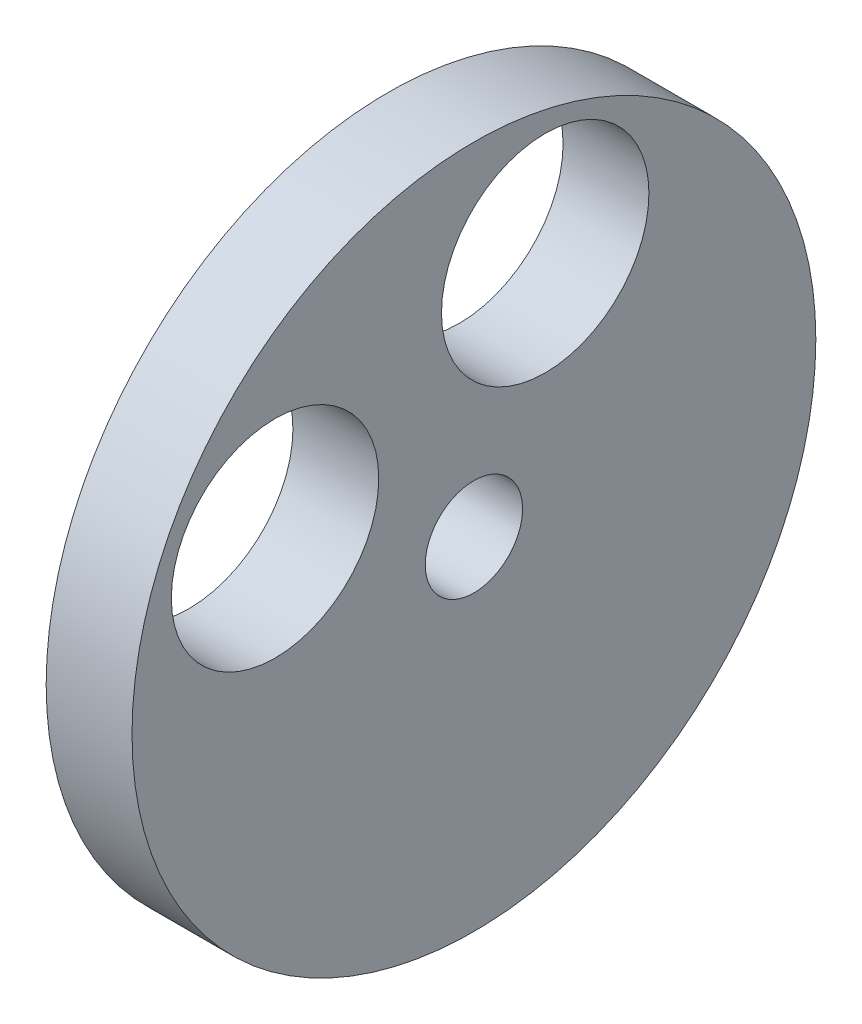
ISO-10303-21;
HEADER;
FILE_DESCRIPTION(('STEP AP214'),'2;1');
FILE_NAME('part.step','',(''),(''),'','','');
FILE_SCHEMA(('AUTOMOTIVE_DESIGN { 1 0 10303 214 1 1 1 1 }'));
ENDSEC;
DATA;
#1=APPLICATION_CONTEXT('core data for automotive mechanical design processes');
#2=APPLICATION_PROTOCOL_DEFINITION('international standard','automotive_design',2000,#1);
#3=PRODUCT_CONTEXT('',#1,'mechanical');
#4=PRODUCT('Part','Part','',(#3));
#5=PRODUCT_RELATED_PRODUCT_CATEGORY('part','',(#4));
#6=PRODUCT_DEFINITION_FORMATION('','',#4);
#7=PRODUCT_DEFINITION_CONTEXT('part definition',#1,'design');
#8=PRODUCT_DEFINITION('design','',#6,#7);
#9=PRODUCT_DEFINITION_SHAPE('','',#8);
#10=(LENGTH_UNIT() NAMED_UNIT(*) SI_UNIT(.MILLI.,.METRE.));
#11=(NAMED_UNIT(*) PLANE_ANGLE_UNIT() SI_UNIT($,.RADIAN.));
#12=(NAMED_UNIT(*) SI_UNIT($,.STERADIAN.) SOLID_ANGLE_UNIT());
#13=UNCERTAINTY_MEASURE_WITH_UNIT(LENGTH_MEASURE(1.E-05),#10,'distance_accuracy_value','');
#14=(GEOMETRIC_REPRESENTATION_CONTEXT(3) GLOBAL_UNCERTAINTY_ASSIGNED_CONTEXT((#13)) GLOBAL_UNIT_ASSIGNED_CONTEXT((#10,
#11,#12)) REPRESENTATION_CONTEXT('',''));
#15=CARTESIAN_POINT('',(0.,0.,0.));
#16=DIRECTION('',(0.,0.,1.));
#17=DIRECTION('',(1.,0.,0.));
#18=AXIS2_PLACEMENT_3D('',#15,#16,#17);
#19=CARTESIAN_POINT('',(80.,23.9,0.));
#20=DIRECTION('',(1.,0.,0.));
#21=DIRECTION('',(0.,0.,-1.));
#22=AXIS2_PLACEMENT_3D('',#19,#20,#21);
#23=PLANE('',#22);
#24=CARTESIAN_POINT('',(80.,14.677159484003,-4.98307028659441));
#25=DIRECTION('',(1.,0.,0.));
#26=DIRECTION('',(0.,0.,-1.));
#27=AXIS2_PLACEMENT_3D('',#24,#25,#26);
#28=CIRCLE('',#27,7.25);
#29=CARTESIAN_POINT('',(80.,14.677159484003,-12.2330702865944));
#30=VERTEX_POINT('',#29);
#31=EDGE_CURVE('E50',#30,#30,#28,.F.);
#32=ORIENTED_EDGE('',*,*,#31,.F.);
#33=EDGE_LOOP('',(#32));
#34=FACE_BOUND('',#33,.T.);
#35=CARTESIAN_POINT('',(80.,6.85475620891489,13.9018817904751));
#36=DIRECTION('',(1.,0.,0.));
#37=DIRECTION('',(0.,0.,-1.));
#38=AXIS2_PLACEMENT_3D('',#35,#36,#37);
#39=CIRCLE('',#38,7.25);
#40=CARTESIAN_POINT('',(80.,6.85475620891489,6.65188179047509));
#41=VERTEX_POINT('',#40);
#42=EDGE_CURVE('E53',#41,#41,#39,.F.);
#43=ORIENTED_EDGE('',*,*,#42,.F.);
#44=EDGE_LOOP('',(#43));
#45=FACE_BOUND('',#44,.T.);
#46=CARTESIAN_POINT('',(80.,0.,0.));
#47=DIRECTION('',(-1.,0.,0.));
#48=DIRECTION('',(0.,0.,1.));
#49=AXIS2_PLACEMENT_3D('',#46,#47,#48);
#50=CIRCLE('',#49,3.4);
#51=CARTESIAN_POINT('',(80.,0.,3.4));
#52=VERTEX_POINT('',#51);
#53=EDGE_CURVE('E10',#52,#52,#50,.T.);
#54=ORIENTED_EDGE('',*,*,#53,.F.);
#55=EDGE_LOOP('',(#54));
#56=FACE_BOUND('',#55,.T.);
#57=CARTESIAN_POINT('',(80.,0.,0.));
#58=DIRECTION('',(-1.,0.,0.));
#59=DIRECTION('',(0.,0.,1.));
#60=AXIS2_PLACEMENT_3D('',#57,#58,#59);
#61=CIRCLE('',#60,23.9);
#62=CARTESIAN_POINT('',(80.,0.,23.9));
#63=VERTEX_POINT('',#62);
#64=EDGE_CURVE('E45',#63,#63,#61,.T.);
#65=ORIENTED_EDGE('',*,*,#64,.T.);
#66=EDGE_LOOP('',(#65));
#67=FACE_BOUND('',#66,.T.);
#68=ADVANCED_FACE('F31',(#34,#45,#56,#67),#23,.F.);
#69=CARTESIAN_POINT('',(-110.,0.,0.));
#70=DIRECTION('',(-1.,0.,0.));
#71=DIRECTION('',(0.,0.,1.));
#72=AXIS2_PLACEMENT_3D('',#69,#70,#71);
#73=CYLINDRICAL_SURFACE('',#72,3.4);
#74=CARTESIAN_POINT('',(86.,0.,0.));
#75=DIRECTION('',(-1.,0.,0.));
#76=DIRECTION('',(0.,0.,1.));
#77=AXIS2_PLACEMENT_3D('',#74,#75,#76);
#78=CIRCLE('',#77,3.4);
#79=CARTESIAN_POINT('',(86.,0.,3.4));
#80=VERTEX_POINT('',#79);
#81=EDGE_CURVE('E37',#80,#80,#78,.T.);
#82=ORIENTED_EDGE('',*,*,#81,.F.);
#83=EDGE_LOOP('',(#82));
#84=FACE_BOUND('',#83,.T.);
#85=ORIENTED_EDGE('',*,*,#53,.T.);
#86=EDGE_LOOP('',(#85));
#87=FACE_BOUND('',#86,.T.);
#88=ADVANCED_FACE('F70',(#84,#87),#73,.F.);
#89=CARTESIAN_POINT('',(86.,3.4,0.));
#90=DIRECTION('',(-1.,0.,0.));
#91=DIRECTION('',(0.,0.,1.));
#92=AXIS2_PLACEMENT_3D('',#89,#90,#91);
#93=PLANE('',#92);
#94=CARTESIAN_POINT('',(86.,14.677159484003,-4.98307028659441));
#95=DIRECTION('',(1.,0.,0.));
#96=DIRECTION('',(0.,0.,-1.));
#97=AXIS2_PLACEMENT_3D('',#94,#95,#96);
#98=CIRCLE('',#97,7.25);
#99=CARTESIAN_POINT('',(86.,14.677159484003,-12.2330702865944));
#100=VERTEX_POINT('',#99);
#101=EDGE_CURVE('E56',#100,#100,#98,.T.);
#102=ORIENTED_EDGE('',*,*,#101,.F.);
#103=EDGE_LOOP('',(#102));
#104=FACE_BOUND('',#103,.T.);
#105=CARTESIAN_POINT('',(86.,6.85475620891489,13.9018817904751));
#106=DIRECTION('',(1.,0.,0.));
#107=DIRECTION('',(0.,0.,-1.));
#108=AXIS2_PLACEMENT_3D('',#105,#106,#107);
#109=CIRCLE('',#108,7.25);
#110=CARTESIAN_POINT('',(86.,6.85475620891489,6.65188179047509));
#111=VERTEX_POINT('',#110);
#112=EDGE_CURVE('E57',#111,#111,#109,.T.);
#113=ORIENTED_EDGE('',*,*,#112,.F.);
#114=EDGE_LOOP('',(#113));
#115=FACE_BOUND('',#114,.T.);
#116=CARTESIAN_POINT('',(86.,0.,0.));
#117=DIRECTION('',(-1.,0.,0.));
#118=DIRECTION('',(0.,0.,1.));
#119=AXIS2_PLACEMENT_3D('',#116,#117,#118);
#120=CIRCLE('',#119,23.9);
#121=CARTESIAN_POINT('',(86.,0.,23.9));
#122=VERTEX_POINT('',#121);
#123=EDGE_CURVE('E41',#122,#122,#120,.T.);
#124=ORIENTED_EDGE('',*,*,#123,.F.);
#125=EDGE_LOOP('',(#124));
#126=FACE_BOUND('',#125,.T.);
#127=ORIENTED_EDGE('',*,*,#81,.T.);
#128=EDGE_LOOP('',(#127));
#129=FACE_BOUND('',#128,.T.);
#130=ADVANCED_FACE('F66',(#104,#115,#126,#129),#93,.F.);
#131=CARTESIAN_POINT('',(-110.,0.,0.));
#132=DIRECTION('',(-1.,0.,0.));
#133=DIRECTION('',(0.,0.,1.));
#134=AXIS2_PLACEMENT_3D('',#131,#132,#133);
#135=CYLINDRICAL_SURFACE('',#134,23.9);
#136=ORIENTED_EDGE('',*,*,#64,.F.);
#137=EDGE_LOOP('',(#136));
#138=FACE_BOUND('',#137,.T.);
#139=ORIENTED_EDGE('',*,*,#123,.T.);
#140=EDGE_LOOP('',(#139));
#141=FACE_BOUND('',#140,.T.);
#142=ADVANCED_FACE('F69',(#138,#141),#135,.T.);
#143=CARTESIAN_POINT('',(86.,6.85475620891489,13.9018817904751));
#144=DIRECTION('',(-1.,0.,0.));
#145=DIRECTION('',(0.,0.,1.));
#146=AXIS2_PLACEMENT_3D('',#143,#144,#145);
#147=CYLINDRICAL_SURFACE('',#146,7.25);
#148=ORIENTED_EDGE('',*,*,#112,.T.);
#149=EDGE_LOOP('',(#148));
#150=FACE_BOUND('',#149,.T.);
#151=ORIENTED_EDGE('',*,*,#42,.T.);
#152=EDGE_LOOP('',(#151));
#153=FACE_BOUND('',#152,.T.);
#154=ADVANCED_FACE('F77',(#150,#153),#147,.F.);
#155=CARTESIAN_POINT('',(86.,14.677159484003,-4.98307028659441));
#156=DIRECTION('',(-1.,0.,0.));
#157=DIRECTION('',(0.,0.,1.));
#158=AXIS2_PLACEMENT_3D('',#155,#156,#157);
#159=CYLINDRICAL_SURFACE('',#158,7.25);
#160=ORIENTED_EDGE('',*,*,#101,.T.);
#161=EDGE_LOOP('',(#160));
#162=FACE_BOUND('',#161,.T.);
#163=ORIENTED_EDGE('',*,*,#31,.T.);
#164=EDGE_LOOP('',(#163));
#165=FACE_BOUND('',#164,.T.);
#166=ADVANCED_FACE('F63',(#162,#165),#159,.F.);
#167=CLOSED_SHELL('',(#68,#88,#130,#142,#154,#166));
#168=MANIFOLD_SOLID_BREP('B2',#167);
#169=ADVANCED_BREP_SHAPE_REPRESENTATION('',(#18,#168),#14);
#170=SHAPE_DEFINITION_REPRESENTATION(#9,#169);
ENDSEC;
END-ISO-10303-21;
